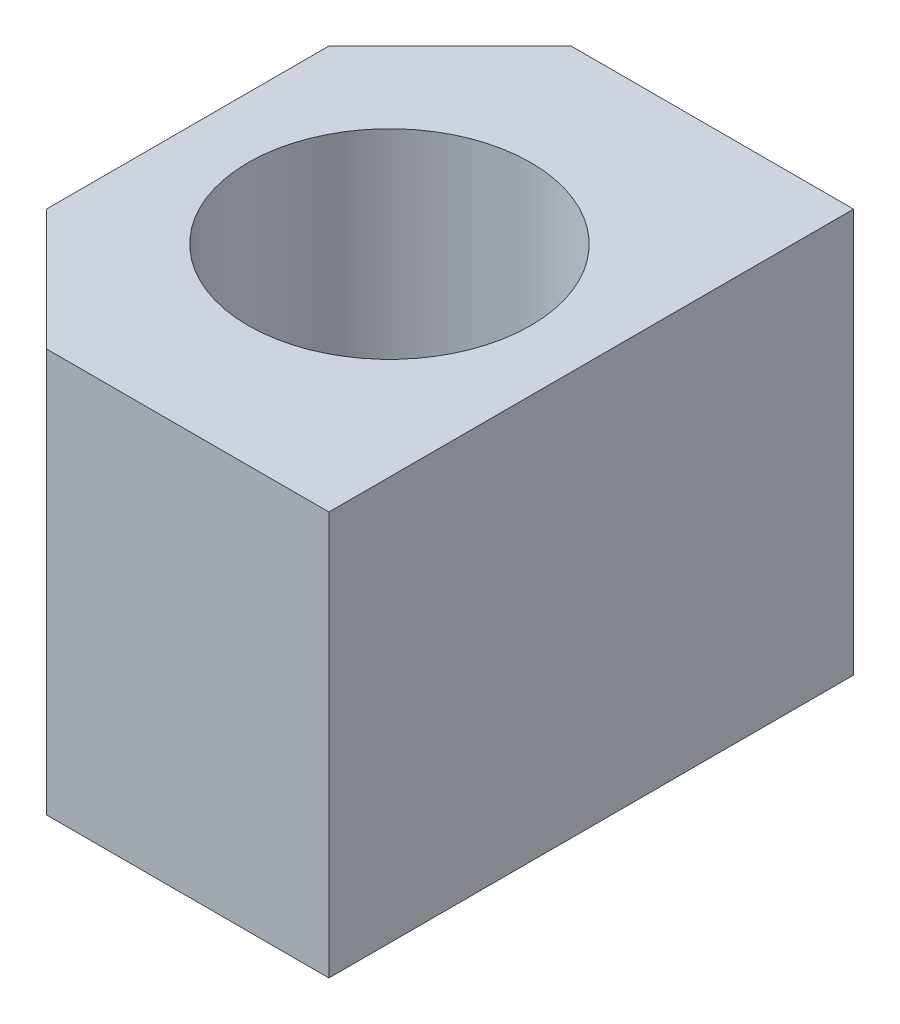
ISO-10303-21;
HEADER;
FILE_DESCRIPTION(('STEP AP214'),'2;1');
FILE_NAME('part.step','',(''),(''),'','','');
FILE_SCHEMA(('AUTOMOTIVE_DESIGN { 1 0 10303 214 1 1 1 1 }'));
ENDSEC;
DATA;
#1=APPLICATION_CONTEXT('core data for automotive mechanical design processes');
#2=APPLICATION_PROTOCOL_DEFINITION('international standard','automotive_design',2000,#1);
#3=PRODUCT_CONTEXT('',#1,'mechanical');
#4=PRODUCT('Part','Part','',(#3));
#5=PRODUCT_RELATED_PRODUCT_CATEGORY('part','',(#4));
#6=PRODUCT_DEFINITION_FORMATION('','',#4);
#7=PRODUCT_DEFINITION_CONTEXT('part definition',#1,'design');
#8=PRODUCT_DEFINITION('design','',#6,#7);
#9=PRODUCT_DEFINITION_SHAPE('','',#8);
#10=(LENGTH_UNIT() NAMED_UNIT(*) SI_UNIT(.MILLI.,.METRE.));
#11=(NAMED_UNIT(*) PLANE_ANGLE_UNIT() SI_UNIT($,.RADIAN.));
#12=(NAMED_UNIT(*) SI_UNIT($,.STERADIAN.) SOLID_ANGLE_UNIT());
#13=UNCERTAINTY_MEASURE_WITH_UNIT(LENGTH_MEASURE(1.E-05),#10,'distance_accuracy_value','');
#14=(GEOMETRIC_REPRESENTATION_CONTEXT(3) GLOBAL_UNCERTAINTY_ASSIGNED_CONTEXT((#13)) GLOBAL_UNIT_ASSIGNED_CONTEXT((#10,
#11,#12)) REPRESENTATION_CONTEXT('',''));
#15=CARTESIAN_POINT('',(0.,0.,0.));
#16=DIRECTION('',(0.,0.,1.));
#17=DIRECTION('',(1.,0.,0.));
#18=AXIS2_PLACEMENT_3D('',#15,#16,#17);
#19=CARTESIAN_POINT('',(0.,40.,0.));
#20=DIRECTION('',(0.,0.,-1.));
#21=DIRECTION('',(-1.,0.,0.));
#22=AXIS2_PLACEMENT_3D('',#19,#20,#21);
#23=PLANE('',#22);
#24=DIRECTION('',(0.,1.,0.));
#25=VECTOR('',#24,1.);
#26=CARTESIAN_POINT('',(12.,-56.0468635614928,0.));
#27=LINE('',#26,#25);
#28=CARTESIAN_POINT('',(12.,0.,0.));
#29=VERTEX_POINT('',#28);
#30=CARTESIAN_POINT('',(12.,40.,0.));
#31=VERTEX_POINT('',#30);
#32=EDGE_CURVE('E96',#29,#31,#27,.T.);
#33=ORIENTED_EDGE('',*,*,#32,.F.);
#34=DIRECTION('',(1.,0.,0.));
#35=VECTOR('',#34,1.);
#36=CARTESIAN_POINT('',(0.,0.,0.));
#37=LINE('',#36,#35);
#38=CARTESIAN_POINT('',(40.,0.,0.));
#39=VERTEX_POINT('',#38);
#40=EDGE_CURVE('E128',#29,#39,#37,.T.);
#41=ORIENTED_EDGE('',*,*,#40,.T.);
#42=DIRECTION('',(0.,-1.,0.));
#43=VECTOR('',#42,1.);
#44=CARTESIAN_POINT('',(40.,40.,0.));
#45=LINE('',#44,#43);
#46=CARTESIAN_POINT('',(40.,40.,0.));
#47=VERTEX_POINT('',#46);
#48=EDGE_CURVE('E133',#47,#39,#45,.T.);
#49=ORIENTED_EDGE('',*,*,#48,.F.);
#50=DIRECTION('',(1.,0.,0.));
#51=VECTOR('',#50,1.);
#52=CARTESIAN_POINT('',(0.,40.,0.));
#53=LINE('',#52,#51);
#54=EDGE_CURVE('E113',#31,#47,#53,.T.);
#55=ORIENTED_EDGE('',*,*,#54,.F.);
#56=EDGE_LOOP('',(#33,#41,#49,#55));
#57=FACE_BOUND('',#56,.T.);
#58=ADVANCED_FACE('F41',(#57),#23,.F.);
#59=CARTESIAN_POINT('',(0.,40.,0.));
#60=DIRECTION('',(0.,-1.,0.));
#61=DIRECTION('',(0.,0.,-1.));
#62=AXIS2_PLACEMENT_3D('',#59,#60,#61);
#63=PLANE('',#62);
#64=CARTESIAN_POINT('',(20.,40.,-26.));
#65=DIRECTION('',(0.,1.,0.));
#66=DIRECTION('',(0.,0.,1.));
#67=AXIS2_PLACEMENT_3D('',#64,#65,#66);
#68=CIRCLE('',#67,14.);
#69=CARTESIAN_POINT('',(20.,40.,-12.));
#70=VERTEX_POINT('',#69);
#71=EDGE_CURVE('E153',#70,#70,#68,.T.);
#72=ORIENTED_EDGE('',*,*,#71,.F.);
#73=EDGE_LOOP('',(#72));
#74=FACE_BOUND('',#73,.T.);
#75=DIRECTION('',(-0.707106781186548,0.,-0.707106781186547));
#76=VECTOR('',#75,1.);
#77=CARTESIAN_POINT('',(6.,40.,-6.));
#78=LINE('',#77,#76);
#79=CARTESIAN_POINT('',(0.,40.,-12.));
#80=VERTEX_POINT('',#79);
#81=EDGE_CURVE('E93',#31,#80,#78,.T.);
#82=ORIENTED_EDGE('',*,*,#81,.F.);
#83=ORIENTED_EDGE('',*,*,#54,.T.);
#84=DIRECTION('',(0.,0.,-1.));
#85=VECTOR('',#84,1.);
#86=CARTESIAN_POINT('',(40.,40.,0.));
#87=LINE('',#86,#85);
#88=CARTESIAN_POINT('',(40.,40.,-52.));
#89=VERTEX_POINT('',#88);
#90=EDGE_CURVE('E116',#47,#89,#87,.T.);
#91=ORIENTED_EDGE('',*,*,#90,.T.);
#92=DIRECTION('',(-1.,0.,0.));
#93=VECTOR('',#92,1.);
#94=CARTESIAN_POINT('',(0.,40.,-52.));
#95=LINE('',#94,#93);
#96=CARTESIAN_POINT('',(12.,40.,-52.));
#97=VERTEX_POINT('',#96);
#98=EDGE_CURVE('E124',#89,#97,#95,.T.);
#99=ORIENTED_EDGE('',*,*,#98,.T.);
#100=DIRECTION('',(-0.707106781186548,0.,0.707106781186547));
#101=VECTOR('',#100,1.);
#102=CARTESIAN_POINT('',(-20.,40.,-20.));
#103=LINE('',#102,#101);
#104=CARTESIAN_POINT('',(0.,40.,-40.));
#105=VERTEX_POINT('',#104);
#106=EDGE_CURVE('E112',#97,#105,#103,.T.);
#107=ORIENTED_EDGE('',*,*,#106,.T.);
#108=DIRECTION('',(0.,0.,1.));
#109=VECTOR('',#108,1.);
#110=CARTESIAN_POINT('',(0.,40.,0.));
#111=LINE('',#110,#109);
#112=EDGE_CURVE('E105',#105,#80,#111,.T.);
#113=ORIENTED_EDGE('',*,*,#112,.T.);
#114=EDGE_LOOP('',(#82,#83,#91,#99,#107,#113));
#115=FACE_BOUND('',#114,.T.);
#116=ADVANCED_FACE('F110',(#74,#115),#63,.F.);
#117=CARTESIAN_POINT('',(0.,0.,0.));
#118=DIRECTION('',(0.,-1.,0.));
#119=DIRECTION('',(0.,0.,-1.));
#120=AXIS2_PLACEMENT_3D('',#117,#118,#119);
#121=PLANE('',#120);
#122=CARTESIAN_POINT('',(20.,0.,-26.));
#123=DIRECTION('',(0.,1.,0.));
#124=DIRECTION('',(0.,0.,1.));
#125=AXIS2_PLACEMENT_3D('',#122,#123,#124);
#126=CIRCLE('',#125,14.);
#127=CARTESIAN_POINT('',(20.,0.,-12.));
#128=VERTEX_POINT('',#127);
#129=EDGE_CURVE('E108',#128,#128,#126,.T.);
#130=ORIENTED_EDGE('',*,*,#129,.T.);
#131=EDGE_LOOP('',(#130));
#132=FACE_BOUND('',#131,.T.);
#133=ORIENTED_EDGE('',*,*,#40,.F.);
#134=DIRECTION('',(-0.707106781186548,0.,-0.707106781186547));
#135=VECTOR('',#134,1.);
#136=CARTESIAN_POINT('',(6.,0.,-6.));
#137=LINE('',#136,#135);
#138=CARTESIAN_POINT('',(0.,0.,-12.));
#139=VERTEX_POINT('',#138);
#140=EDGE_CURVE('E11',#29,#139,#137,.T.);
#141=ORIENTED_EDGE('',*,*,#140,.T.);
#142=DIRECTION('',(0.,0.,1.));
#143=VECTOR('',#142,1.);
#144=CARTESIAN_POINT('',(0.,0.,0.));
#145=LINE('',#144,#143);
#146=CARTESIAN_POINT('',(0.,0.,-40.));
#147=VERTEX_POINT('',#146);
#148=EDGE_CURVE('E107',#147,#139,#145,.T.);
#149=ORIENTED_EDGE('',*,*,#148,.F.);
#150=DIRECTION('',(-0.707106781186548,0.,0.707106781186547));
#151=VECTOR('',#150,1.);
#152=CARTESIAN_POINT('',(-20.,0.,-20.));
#153=LINE('',#152,#151);
#154=CARTESIAN_POINT('',(12.,0.,-52.));
#155=VERTEX_POINT('',#154);
#156=EDGE_CURVE('E49',#155,#147,#153,.T.);
#157=ORIENTED_EDGE('',*,*,#156,.F.);
#158=DIRECTION('',(-1.,0.,0.));
#159=VECTOR('',#158,1.);
#160=CARTESIAN_POINT('',(0.,0.,-52.));
#161=LINE('',#160,#159);
#162=CARTESIAN_POINT('',(40.,0.,-52.));
#163=VERTEX_POINT('',#162);
#164=EDGE_CURVE('E114',#163,#155,#161,.T.);
#165=ORIENTED_EDGE('',*,*,#164,.F.);
#166=DIRECTION('',(0.,0.,-1.));
#167=VECTOR('',#166,1.);
#168=CARTESIAN_POINT('',(40.,0.,0.));
#169=LINE('',#168,#167);
#170=EDGE_CURVE('E118',#39,#163,#169,.T.);
#171=ORIENTED_EDGE('',*,*,#170,.F.);
#172=EDGE_LOOP('',(#133,#141,#149,#157,#165,#171));
#173=FACE_BOUND('',#172,.T.);
#174=ADVANCED_FACE('F142',(#132,#173),#121,.T.);
#175=CARTESIAN_POINT('',(0.,40.,-52.));
#176=DIRECTION('',(0.,0.,1.));
#177=DIRECTION('',(1.,0.,0.));
#178=AXIS2_PLACEMENT_3D('',#175,#176,#177);
#179=PLANE('',#178);
#180=DIRECTION('',(0.,-1.,0.));
#181=VECTOR('',#180,1.);
#182=CARTESIAN_POINT('',(12.,186.046863561493,-52.));
#183=LINE('',#182,#181);
#184=EDGE_CURVE('E63',#97,#155,#183,.T.);
#185=ORIENTED_EDGE('',*,*,#184,.F.);
#186=ORIENTED_EDGE('',*,*,#98,.F.);
#187=DIRECTION('',(0.,-1.,0.));
#188=VECTOR('',#187,1.);
#189=CARTESIAN_POINT('',(40.,40.,-52.));
#190=LINE('',#189,#188);
#191=EDGE_CURVE('E126',#89,#163,#190,.T.);
#192=ORIENTED_EDGE('',*,*,#191,.T.);
#193=ORIENTED_EDGE('',*,*,#164,.T.);
#194=EDGE_LOOP('',(#185,#186,#192,#193));
#195=FACE_BOUND('',#194,.T.);
#196=ADVANCED_FACE('F144',(#195),#179,.F.);
#197=CARTESIAN_POINT('',(0.,40.,0.));
#198=DIRECTION('',(1.,0.,0.));
#199=DIRECTION('',(0.,0.,-1.));
#200=AXIS2_PLACEMENT_3D('',#197,#198,#199);
#201=PLANE('',#200);
#202=ORIENTED_EDGE('',*,*,#148,.T.);
#203=DIRECTION('',(0.,1.,0.));
#204=VECTOR('',#203,1.);
#205=CARTESIAN_POINT('',(0.,-56.0468635614928,-12.));
#206=LINE('',#205,#204);
#207=EDGE_CURVE('E56',#139,#80,#206,.T.);
#208=ORIENTED_EDGE('',*,*,#207,.T.);
#209=ORIENTED_EDGE('',*,*,#112,.F.);
#210=DIRECTION('',(0.,-1.,0.));
#211=VECTOR('',#210,1.);
#212=CARTESIAN_POINT('',(0.,186.046863561493,-40.));
#213=LINE('',#212,#211);
#214=EDGE_CURVE('E138',#105,#147,#213,.T.);
#215=ORIENTED_EDGE('',*,*,#214,.T.);
#216=EDGE_LOOP('',(#202,#208,#209,#215));
#217=FACE_BOUND('',#216,.T.);
#218=ADVANCED_FACE('F43',(#217),#201,.F.);
#219=CARTESIAN_POINT('',(40.,40.,0.));
#220=DIRECTION('',(-1.,0.,0.));
#221=DIRECTION('',(0.,0.,1.));
#222=AXIS2_PLACEMENT_3D('',#219,#220,#221);
#223=PLANE('',#222);
#224=ORIENTED_EDGE('',*,*,#170,.T.);
#225=ORIENTED_EDGE('',*,*,#191,.F.);
#226=ORIENTED_EDGE('',*,*,#90,.F.);
#227=ORIENTED_EDGE('',*,*,#48,.T.);
#228=EDGE_LOOP('',(#224,#225,#226,#227));
#229=FACE_BOUND('',#228,.T.);
#230=ADVANCED_FACE('F148',(#229),#223,.F.);
#231=CARTESIAN_POINT('',(12.,186.046863561493,-52.));
#232=DIRECTION('',(0.707106781186547,0.,0.707106781186548));
#233=DIRECTION('',(0.707106781186548,0.,-0.707106781186547));
#234=AXIS2_PLACEMENT_3D('',#231,#232,#233);
#235=PLANE('',#234);
#236=ORIENTED_EDGE('',*,*,#106,.F.);
#237=ORIENTED_EDGE('',*,*,#184,.T.);
#238=ORIENTED_EDGE('',*,*,#156,.T.);
#239=ORIENTED_EDGE('',*,*,#214,.F.);
#240=EDGE_LOOP('',(#236,#237,#238,#239));
#241=FACE_BOUND('',#240,.T.);
#242=ADVANCED_FACE('F137',(#241),#235,.F.);
#243=CARTESIAN_POINT('',(0.,-56.0468635614928,-12.));
#244=DIRECTION('',(-0.707106781186547,0.,0.707106781186548));
#245=DIRECTION('',(0.707106781186548,0.,0.707106781186547));
#246=AXIS2_PLACEMENT_3D('',#243,#244,#245);
#247=PLANE('',#246);
#248=ORIENTED_EDGE('',*,*,#32,.T.);
#249=ORIENTED_EDGE('',*,*,#81,.T.);
#250=ORIENTED_EDGE('',*,*,#207,.F.);
#251=ORIENTED_EDGE('',*,*,#140,.F.);
#252=EDGE_LOOP('',(#248,#249,#250,#251));
#253=FACE_BOUND('',#252,.T.);
#254=ADVANCED_FACE('F94',(#253),#247,.T.);
#255=CARTESIAN_POINT('',(20.,0.,-26.));
#256=DIRECTION('',(0.,1.,0.));
#257=DIRECTION('',(0.,0.,1.));
#258=AXIS2_PLACEMENT_3D('',#255,#256,#257);
#259=CYLINDRICAL_SURFACE('',#258,14.);
#260=ORIENTED_EDGE('',*,*,#129,.F.);
#261=EDGE_LOOP('',(#260));
#262=FACE_BOUND('',#261,.T.);
#263=ORIENTED_EDGE('',*,*,#71,.T.);
#264=EDGE_LOOP('',(#263));
#265=FACE_BOUND('',#264,.T.);
#266=ADVANCED_FACE('F161',(#262,#265),#259,.F.);
#267=CLOSED_SHELL('',(#58,#116,#174,#196,#218,#230,#242,#254,#266));
#268=MANIFOLD_SOLID_BREP('B2',#267);
#269=ADVANCED_BREP_SHAPE_REPRESENTATION('',(#18,#268),#14);
#270=SHAPE_DEFINITION_REPRESENTATION(#9,#269);
ENDSEC;
END-ISO-10303-21;
